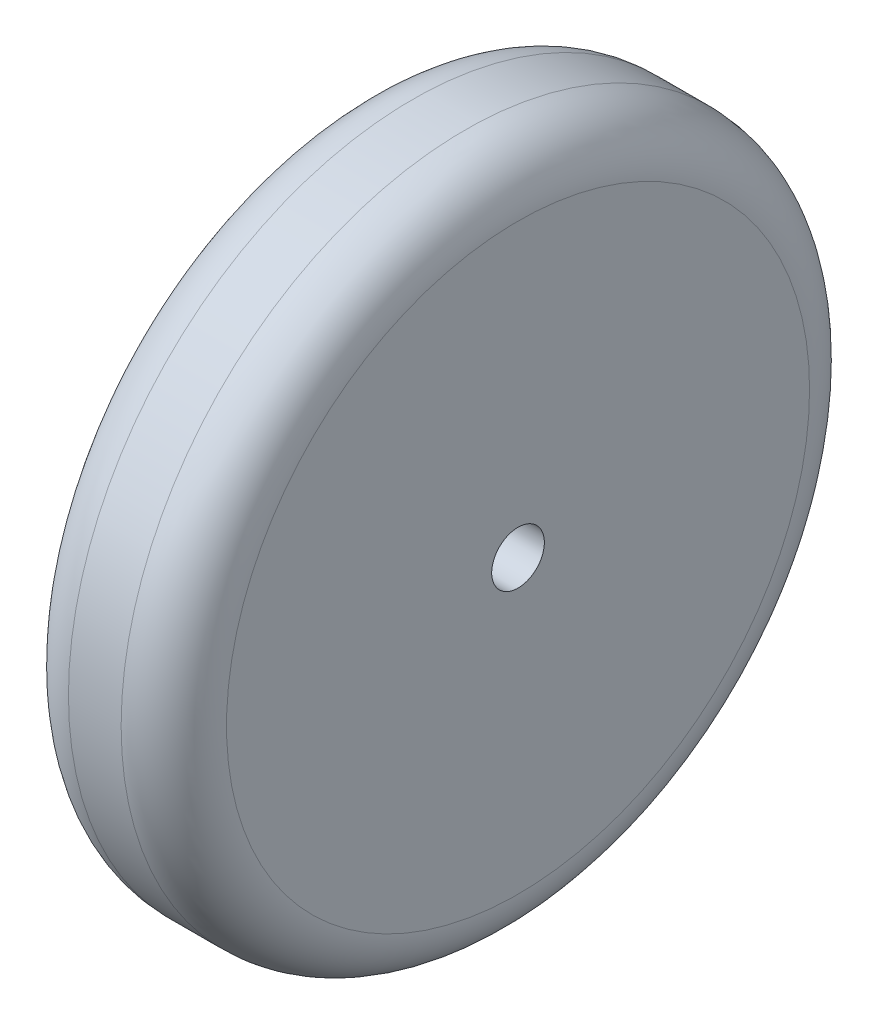
ISO-10303-21;
HEADER;
FILE_DESCRIPTION(('STEP AP214'),'2;1');
FILE_NAME('part.step','',(''),(''),'','','');
FILE_SCHEMA(('AUTOMOTIVE_DESIGN { 1 0 10303 214 1 1 1 1 }'));
ENDSEC;
DATA;
#1=APPLICATION_CONTEXT('core data for automotive mechanical design processes');
#2=APPLICATION_PROTOCOL_DEFINITION('international standard','automotive_design',2000,#1);
#3=PRODUCT_CONTEXT('',#1,'mechanical');
#4=PRODUCT('Part','Part','',(#3));
#5=PRODUCT_RELATED_PRODUCT_CATEGORY('part','',(#4));
#6=PRODUCT_DEFINITION_FORMATION('','',#4);
#7=PRODUCT_DEFINITION_CONTEXT('part definition',#1,'design');
#8=PRODUCT_DEFINITION('design','',#6,#7);
#9=PRODUCT_DEFINITION_SHAPE('','',#8);
#10=(LENGTH_UNIT() NAMED_UNIT(*) SI_UNIT(.MILLI.,.METRE.));
#11=(NAMED_UNIT(*) PLANE_ANGLE_UNIT() SI_UNIT($,.RADIAN.));
#12=(NAMED_UNIT(*) SI_UNIT($,.STERADIAN.) SOLID_ANGLE_UNIT());
#13=UNCERTAINTY_MEASURE_WITH_UNIT(LENGTH_MEASURE(1.E-05),#10,'distance_accuracy_value','');
#14=(GEOMETRIC_REPRESENTATION_CONTEXT(3) GLOBAL_UNCERTAINTY_ASSIGNED_CONTEXT((#13)) GLOBAL_UNIT_ASSIGNED_CONTEXT((#10,
#11,#12)) REPRESENTATION_CONTEXT('',''));
#15=CARTESIAN_POINT('',(0.,0.,0.));
#16=DIRECTION('',(0.,0.,1.));
#17=DIRECTION('',(1.,0.,0.));
#18=AXIS2_PLACEMENT_3D('',#15,#16,#17);
#19=CARTESIAN_POINT('',(30.,0.,0.));
#20=DIRECTION('',(1.,0.,0.));
#21=DIRECTION('',(0.,0.,-1.));
#22=AXIS2_PLACEMENT_3D('',#19,#20,#21);
#23=PLANE('',#22);
#24=CARTESIAN_POINT('',(30.,0.,0.));
#25=DIRECTION('',(1.,0.,0.));
#26=DIRECTION('',(0.,0.,-1.));
#27=AXIS2_PLACEMENT_3D('',#24,#25,#26);
#28=CIRCLE('',#27,55.3276522754168);
#29=CARTESIAN_POINT('',(30.,0.,-55.3276522754168));
#30=VERTEX_POINT('',#29);
#31=EDGE_CURVE('E45',#30,#30,#28,.T.);
#32=ORIENTED_EDGE('',*,*,#31,.T.);
#33=EDGE_LOOP('',(#32));
#34=FACE_BOUND('',#33,.T.);
#35=CARTESIAN_POINT('',(30.,0.,0.));
#36=DIRECTION('',(1.,0.,0.));
#37=DIRECTION('',(0.,0.,-1.));
#38=AXIS2_PLACEMENT_3D('',#35,#36,#37);
#39=CIRCLE('',#38,5.);
#40=CARTESIAN_POINT('',(30.,0.,-5.));
#41=VERTEX_POINT('',#40);
#42=EDGE_CURVE('E50',#41,#41,#39,.T.);
#43=ORIENTED_EDGE('',*,*,#42,.F.);
#44=EDGE_LOOP('',(#43));
#45=FACE_BOUND('',#44,.T.);
#46=ADVANCED_FACE('F30',(#34,#45),#23,.T.);
#47=CARTESIAN_POINT('',(0.,0.,0.));
#48=DIRECTION('',(1.,0.,0.));
#49=DIRECTION('',(0.,0.,-1.));
#50=AXIS2_PLACEMENT_3D('',#47,#48,#49);
#51=PLANE('',#50);
#52=CARTESIAN_POINT('',(0.,0.,0.));
#53=DIRECTION('',(1.,0.,0.));
#54=DIRECTION('',(0.,0.,-1.));
#55=AXIS2_PLACEMENT_3D('',#52,#53,#54);
#56=CIRCLE('',#55,55.3276522754168);
#57=CARTESIAN_POINT('',(0.,0.,-55.3276522754168));
#58=VERTEX_POINT('',#57);
#59=EDGE_CURVE('E10',#58,#58,#56,.F.);
#60=ORIENTED_EDGE('',*,*,#59,.T.);
#61=EDGE_LOOP('',(#60));
#62=FACE_BOUND('',#61,.T.);
#63=CARTESIAN_POINT('',(0.,0.,0.));
#64=DIRECTION('',(1.,0.,0.));
#65=DIRECTION('',(0.,0.,-1.));
#66=AXIS2_PLACEMENT_3D('',#63,#64,#65);
#67=CIRCLE('',#66,5.);
#68=CARTESIAN_POINT('',(0.,0.,-5.));
#69=VERTEX_POINT('',#68);
#70=EDGE_CURVE('E51',#69,#69,#67,.T.);
#71=ORIENTED_EDGE('',*,*,#70,.T.);
#72=EDGE_LOOP('',(#71));
#73=FACE_BOUND('',#72,.T.);
#74=ADVANCED_FACE('F61',(#62,#73),#51,.F.);
#75=CARTESIAN_POINT('',(30.,0.,0.));
#76=DIRECTION('',(-1.,0.,0.));
#77=DIRECTION('',(0.,0.,1.));
#78=AXIS2_PLACEMENT_3D('',#75,#76,#77);
#79=CYLINDRICAL_SURFACE('',#78,65.3276522754168);
#80=CARTESIAN_POINT('',(20.,0.,0.));
#81=DIRECTION('',(1.,0.,0.));
#82=DIRECTION('',(0.,0.,-1.));
#83=AXIS2_PLACEMENT_3D('',#80,#81,#82);
#84=CIRCLE('',#83,65.3276522754168);
#85=CARTESIAN_POINT('',(20.,0.,-65.3276522754168));
#86=VERTEX_POINT('',#85);
#87=EDGE_CURVE('E37',#86,#86,#84,.F.);
#88=ORIENTED_EDGE('',*,*,#87,.T.);
#89=EDGE_LOOP('',(#88));
#90=FACE_BOUND('',#89,.T.);
#91=CARTESIAN_POINT('',(10.,0.,0.));
#92=DIRECTION('',(1.,0.,0.));
#93=DIRECTION('',(0.,0.,-1.));
#94=AXIS2_PLACEMENT_3D('',#91,#92,#93);
#95=CIRCLE('',#94,65.3276522754168);
#96=CARTESIAN_POINT('',(10.,0.,-65.3276522754168));
#97=VERTEX_POINT('',#96);
#98=EDGE_CURVE('E41',#97,#97,#95,.T.);
#99=ORIENTED_EDGE('',*,*,#98,.T.);
#100=EDGE_LOOP('',(#99));
#101=FACE_BOUND('',#100,.T.);
#102=ADVANCED_FACE('F67',(#90,#101),#79,.T.);
#103=CARTESIAN_POINT('',(30.,0.,0.));
#104=DIRECTION('',(-1.,0.,0.));
#105=DIRECTION('',(0.,0.,1.));
#106=AXIS2_PLACEMENT_3D('',#103,#104,#105);
#107=CYLINDRICAL_SURFACE('',#106,5.);
#108=ORIENTED_EDGE('',*,*,#42,.T.);
#109=EDGE_LOOP('',(#108));
#110=FACE_BOUND('',#109,.T.);
#111=ORIENTED_EDGE('',*,*,#70,.F.);
#112=EDGE_LOOP('',(#111));
#113=FACE_BOUND('',#112,.T.);
#114=ADVANCED_FACE('F57',(#110,#113),#107,.F.);
#115=CARTESIAN_POINT('',(20.,0.,0.));
#116=DIRECTION('',(1.,0.,0.));
#117=DIRECTION('',(0.,0.,-1.));
#118=AXIS2_PLACEMENT_3D('',#115,#116,#117);
#119=TOROIDAL_SURFACE('',#118,55.3276522754168,10.);
#120=ORIENTED_EDGE('',*,*,#87,.F.);
#121=EDGE_LOOP('',(#120));
#122=FACE_BOUND('',#121,.T.);
#123=ORIENTED_EDGE('',*,*,#31,.F.);
#124=EDGE_LOOP('',(#123));
#125=FACE_BOUND('',#124,.T.);
#126=ADVANCED_FACE('F72',(#122,#125),#119,.T.);
#127=CARTESIAN_POINT('',(10.,0.,0.));
#128=DIRECTION('',(1.,0.,0.));
#129=DIRECTION('',(0.,0.,-1.));
#130=AXIS2_PLACEMENT_3D('',#127,#128,#129);
#131=TOROIDAL_SURFACE('',#130,55.3276522754168,10.);
#132=ORIENTED_EDGE('',*,*,#59,.F.);
#133=EDGE_LOOP('',(#132));
#134=FACE_BOUND('',#133,.T.);
#135=ORIENTED_EDGE('',*,*,#98,.F.);
#136=EDGE_LOOP('',(#135));
#137=FACE_BOUND('',#136,.T.);
#138=ADVANCED_FACE('F32',(#134,#137),#131,.T.);
#139=CLOSED_SHELL('',(#46,#74,#102,#114,#126,#138));
#140=MANIFOLD_SOLID_BREP('B2',#139);
#141=ADVANCED_BREP_SHAPE_REPRESENTATION('',(#18,#140),#14);
#142=SHAPE_DEFINITION_REPRESENTATION(#9,#141);
ENDSEC;
END-ISO-10303-21;
